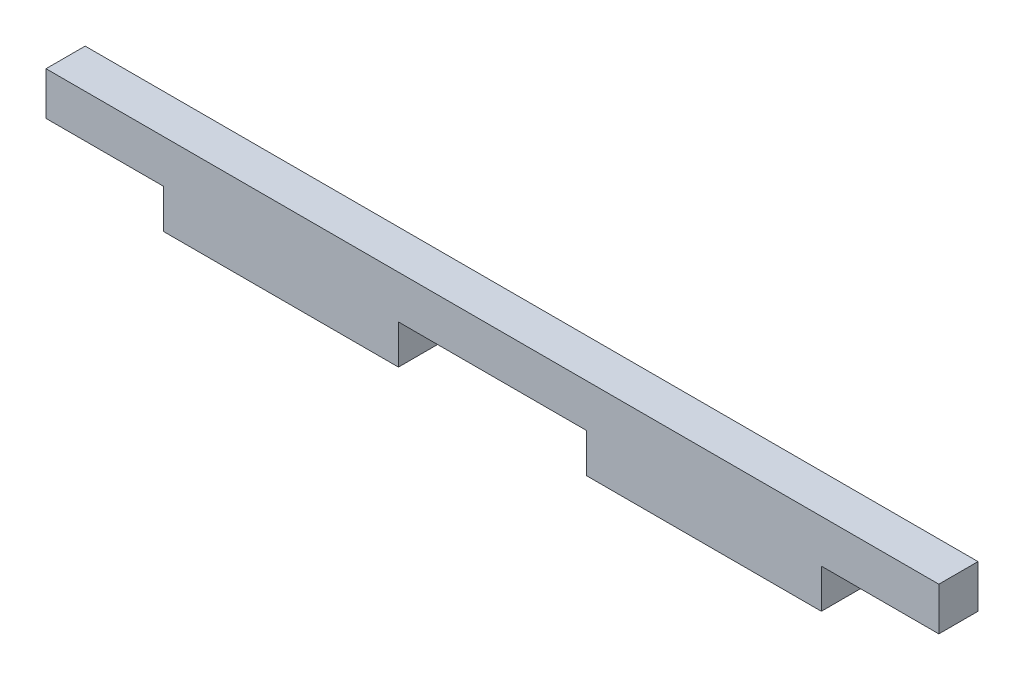
ISO-10303-21;
HEADER;
FILE_DESCRIPTION(('STEP AP214'),'2;1');
FILE_NAME('part.step','',(''),(''),'','','');
FILE_SCHEMA(('AUTOMOTIVE_DESIGN { 1 0 10303 214 1 1 1 1 }'));
ENDSEC;
DATA;
#1=APPLICATION_CONTEXT('core data for automotive mechanical design processes');
#2=APPLICATION_PROTOCOL_DEFINITION('international standard','automotive_design',2000,#1);
#3=PRODUCT_CONTEXT('',#1,'mechanical');
#4=PRODUCT('Part','Part','',(#3));
#5=PRODUCT_RELATED_PRODUCT_CATEGORY('part','',(#4));
#6=PRODUCT_DEFINITION_FORMATION('','',#4);
#7=PRODUCT_DEFINITION_CONTEXT('part definition',#1,'design');
#8=PRODUCT_DEFINITION('design','',#6,#7);
#9=PRODUCT_DEFINITION_SHAPE('','',#8);
#10=(LENGTH_UNIT() NAMED_UNIT(*) SI_UNIT(.MILLI.,.METRE.));
#11=(NAMED_UNIT(*) PLANE_ANGLE_UNIT() SI_UNIT($,.RADIAN.));
#12=(NAMED_UNIT(*) SI_UNIT($,.STERADIAN.) SOLID_ANGLE_UNIT());
#13=UNCERTAINTY_MEASURE_WITH_UNIT(LENGTH_MEASURE(1.E-05),#10,'distance_accuracy_value','');
#14=(GEOMETRIC_REPRESENTATION_CONTEXT(3) GLOBAL_UNCERTAINTY_ASSIGNED_CONTEXT((#13)) GLOBAL_UNIT_ASSIGNED_CONTEXT((#10,
#11,#12)) REPRESENTATION_CONTEXT('',''));
#15=CARTESIAN_POINT('',(0.,0.,0.));
#16=DIRECTION('',(0.,0.,1.));
#17=DIRECTION('',(1.,0.,0.));
#18=AXIS2_PLACEMENT_3D('',#15,#16,#17);
#19=CARTESIAN_POINT('',(-114.,0.,5.));
#20=DIRECTION('',(-1.,0.,0.));
#21=DIRECTION('',(0.,0.,1.));
#22=AXIS2_PLACEMENT_3D('',#19,#20,#21);
#23=PLANE('',#22);
#24=DIRECTION('',(0.,1.,0.));
#25=VECTOR('',#24,1.);
#26=CARTESIAN_POINT('',(-114.,0.,0.));
#27=LINE('',#26,#25);
#28=CARTESIAN_POINT('',(-114.,0.,0.));
#29=VERTEX_POINT('',#28);
#30=CARTESIAN_POINT('',(-114.,5.49999999999998,0.));
#31=VERTEX_POINT('',#30);
#32=EDGE_CURVE('E232',#29,#31,#27,.T.);
#33=ORIENTED_EDGE('',*,*,#32,.F.);
#34=DIRECTION('',(0.,0.,-1.));
#35=VECTOR('',#34,1.);
#36=CARTESIAN_POINT('',(-114.,0.,5.));
#37=LINE('',#36,#35);
#38=CARTESIAN_POINT('',(-114.,0.,5.));
#39=VERTEX_POINT('',#38);
#40=EDGE_CURVE('E11',#39,#29,#37,.T.);
#41=ORIENTED_EDGE('',*,*,#40,.F.);
#42=DIRECTION('',(0.,1.,0.));
#43=VECTOR('',#42,1.);
#44=CARTESIAN_POINT('',(-114.,0.,5.));
#45=LINE('',#44,#43);
#46=CARTESIAN_POINT('',(-114.,5.49999999999998,5.));
#47=VERTEX_POINT('',#46);
#48=EDGE_CURVE('E171',#39,#47,#45,.T.);
#49=ORIENTED_EDGE('',*,*,#48,.T.);
#50=DIRECTION('',(0.,0.,-1.));
#51=VECTOR('',#50,1.);
#52=CARTESIAN_POINT('',(-114.,5.49999999999998,5.));
#53=LINE('',#52,#51);
#54=EDGE_CURVE('E104',#47,#31,#53,.T.);
#55=ORIENTED_EDGE('',*,*,#54,.T.);
#56=EDGE_LOOP('',(#33,#41,#49,#55));
#57=FACE_BOUND('',#56,.T.);
#58=ADVANCED_FACE('F41',(#57),#23,.T.);
#59=CARTESIAN_POINT('',(0.,0.,5.));
#60=DIRECTION('',(0.,-1.,0.));
#61=DIRECTION('',(1.,0.,0.));
#62=AXIS2_PLACEMENT_3D('',#59,#60,#61);
#63=PLANE('',#62);
#64=DIRECTION('',(-1.,0.,0.));
#65=VECTOR('',#64,1.);
#66=CARTESIAN_POINT('',(0.,0.,0.));
#67=LINE('',#66,#65);
#68=CARTESIAN_POINT('',(-99.,0.,0.));
#69=VERTEX_POINT('',#68);
#70=EDGE_CURVE('E224',#69,#29,#67,.T.);
#71=ORIENTED_EDGE('',*,*,#70,.F.);
#72=DIRECTION('',(0.,0.,-1.));
#73=VECTOR('',#72,1.);
#74=CARTESIAN_POINT('',(-99.,0.,5.));
#75=LINE('',#74,#73);
#76=CARTESIAN_POINT('',(-99.,0.,5.));
#77=VERTEX_POINT('',#76);
#78=EDGE_CURVE('E50',#77,#69,#75,.T.);
#79=ORIENTED_EDGE('',*,*,#78,.F.);
#80=DIRECTION('',(-1.,0.,0.));
#81=VECTOR('',#80,1.);
#82=CARTESIAN_POINT('',(0.,0.,5.));
#83=LINE('',#82,#81);
#84=EDGE_CURVE('E158',#77,#39,#83,.T.);
#85=ORIENTED_EDGE('',*,*,#84,.T.);
#86=ORIENTED_EDGE('',*,*,#40,.T.);
#87=EDGE_LOOP('',(#71,#79,#85,#86));
#88=FACE_BOUND('',#87,.T.);
#89=ADVANCED_FACE('F230',(#88),#63,.T.);
#90=CARTESIAN_POINT('',(-99.,-2.74780198594726E-13,5.));
#91=DIRECTION('',(1.,0.,0.));
#92=DIRECTION('',(0.,1.,0.));
#93=AXIS2_PLACEMENT_3D('',#90,#91,#92);
#94=PLANE('',#93);
#95=DIRECTION('',(0.,-1.,0.));
#96=VECTOR('',#95,1.);
#97=CARTESIAN_POINT('',(-99.,-2.74780198594726E-13,0.));
#98=LINE('',#97,#96);
#99=CARTESIAN_POINT('',(-99.,-5.00000000000001,0.));
#100=VERTEX_POINT('',#99);
#101=EDGE_CURVE('E218',#69,#100,#98,.T.);
#102=ORIENTED_EDGE('',*,*,#101,.T.);
#103=DIRECTION('',(0.,0.,-1.));
#104=VECTOR('',#103,1.);
#105=CARTESIAN_POINT('',(-99.,-5.00000000000001,5.));
#106=LINE('',#105,#104);
#107=CARTESIAN_POINT('',(-99.,-5.00000000000001,5.));
#108=VERTEX_POINT('',#107);
#109=EDGE_CURVE('E209',#108,#100,#106,.T.);
#110=ORIENTED_EDGE('',*,*,#109,.F.);
#111=DIRECTION('',(0.,-1.,0.));
#112=VECTOR('',#111,1.);
#113=CARTESIAN_POINT('',(-99.,-2.74780198594726E-13,5.));
#114=LINE('',#113,#112);
#115=EDGE_CURVE('E170',#77,#108,#114,.T.);
#116=ORIENTED_EDGE('',*,*,#115,.F.);
#117=ORIENTED_EDGE('',*,*,#78,.T.);
#118=EDGE_LOOP('',(#102,#110,#116,#117));
#119=FACE_BOUND('',#118,.T.);
#120=ADVANCED_FACE('F216',(#119),#94,.F.);
#121=CARTESIAN_POINT('',(0.,-5.00000000000001,5.));
#122=DIRECTION('',(0.,1.,0.));
#123=DIRECTION('',(-1.,0.,0.));
#124=AXIS2_PLACEMENT_3D('',#121,#122,#123);
#125=PLANE('',#124);
#126=DIRECTION('',(1.,0.,0.));
#127=VECTOR('',#126,1.);
#128=CARTESIAN_POINT('',(0.,-5.00000000000001,0.));
#129=LINE('',#128,#127);
#130=CARTESIAN_POINT('',(-69.,-5.00000000000001,0.));
#131=VERTEX_POINT('',#130);
#132=EDGE_CURVE('E227',#100,#131,#129,.T.);
#133=ORIENTED_EDGE('',*,*,#132,.T.);
#134=DIRECTION('',(0.,0.,-1.));
#135=VECTOR('',#134,1.);
#136=CARTESIAN_POINT('',(-69.,-5.00000000000001,5.));
#137=LINE('',#136,#135);
#138=CARTESIAN_POINT('',(-69.,-5.00000000000001,5.));
#139=VERTEX_POINT('',#138);
#140=EDGE_CURVE('E206',#139,#131,#137,.T.);
#141=ORIENTED_EDGE('',*,*,#140,.F.);
#142=DIRECTION('',(1.,0.,0.));
#143=VECTOR('',#142,1.);
#144=CARTESIAN_POINT('',(0.,-5.00000000000001,5.));
#145=LINE('',#144,#143);
#146=EDGE_CURVE('E176',#108,#139,#145,.T.);
#147=ORIENTED_EDGE('',*,*,#146,.F.);
#148=ORIENTED_EDGE('',*,*,#109,.T.);
#149=EDGE_LOOP('',(#133,#141,#147,#148));
#150=FACE_BOUND('',#149,.T.);
#151=ADVANCED_FACE('F280',(#150),#125,.F.);
#152=CARTESIAN_POINT('',(-69.,0.,5.));
#153=DIRECTION('',(1.,0.,0.));
#154=DIRECTION('',(0.,0.,-1.));
#155=AXIS2_PLACEMENT_3D('',#152,#153,#154);
#156=PLANE('',#155);
#157=DIRECTION('',(0.,-1.,0.));
#158=VECTOR('',#157,1.);
#159=CARTESIAN_POINT('',(-69.,0.,0.));
#160=LINE('',#159,#158);
#161=CARTESIAN_POINT('',(-69.,0.,0.));
#162=VERTEX_POINT('',#161);
#163=EDGE_CURVE('E242',#162,#131,#160,.T.);
#164=ORIENTED_EDGE('',*,*,#163,.F.);
#165=DIRECTION('',(0.,0.,-1.));
#166=VECTOR('',#165,1.);
#167=CARTESIAN_POINT('',(-69.,0.,5.));
#168=LINE('',#167,#166);
#169=CARTESIAN_POINT('',(-69.,0.,5.));
#170=VERTEX_POINT('',#169);
#171=EDGE_CURVE('E203',#170,#162,#168,.T.);
#172=ORIENTED_EDGE('',*,*,#171,.F.);
#173=DIRECTION('',(0.,-1.,0.));
#174=VECTOR('',#173,1.);
#175=CARTESIAN_POINT('',(-69.,0.,5.));
#176=LINE('',#175,#174);
#177=EDGE_CURVE('E167',#170,#139,#176,.T.);
#178=ORIENTED_EDGE('',*,*,#177,.T.);
#179=ORIENTED_EDGE('',*,*,#140,.T.);
#180=EDGE_LOOP('',(#164,#172,#178,#179));
#181=FACE_BOUND('',#180,.T.);
#182=ADVANCED_FACE('F276',(#181),#156,.T.);
#183=CARTESIAN_POINT('',(-45.,0.,0.));
#184=VERTEX_POINT('',#183);
#185=EDGE_CURVE('E234',#184,#162,#67,.T.);
#186=ORIENTED_EDGE('',*,*,#185,.F.);
#187=DIRECTION('',(0.,0.,-1.));
#188=VECTOR('',#187,1.);
#189=CARTESIAN_POINT('',(-45.,0.,5.));
#190=LINE('',#189,#188);
#191=CARTESIAN_POINT('',(-45.,0.,5.));
#192=VERTEX_POINT('',#191);
#193=EDGE_CURVE('E200',#192,#184,#190,.T.);
#194=ORIENTED_EDGE('',*,*,#193,.F.);
#195=EDGE_CURVE('E157',#192,#170,#83,.T.);
#196=ORIENTED_EDGE('',*,*,#195,.T.);
#197=ORIENTED_EDGE('',*,*,#171,.T.);
#198=EDGE_LOOP('',(#186,#194,#196,#197));
#199=FACE_BOUND('',#198,.T.);
#200=ADVANCED_FACE('F272',(#199),#63,.T.);
#201=CARTESIAN_POINT('',(-45.,0.,5.));
#202=DIRECTION('',(1.,0.,0.));
#203=DIRECTION('',(0.,0.,-1.));
#204=AXIS2_PLACEMENT_3D('',#201,#202,#203);
#205=PLANE('',#204);
#206=DIRECTION('',(0.,-1.,0.));
#207=VECTOR('',#206,1.);
#208=CARTESIAN_POINT('',(-45.,0.,0.));
#209=LINE('',#208,#207);
#210=CARTESIAN_POINT('',(-45.,-5.00000000000001,0.));
#211=VERTEX_POINT('',#210);
#212=EDGE_CURVE('E241',#184,#211,#209,.T.);
#213=ORIENTED_EDGE('',*,*,#212,.T.);
#214=DIRECTION('',(0.,0.,-1.));
#215=VECTOR('',#214,1.);
#216=CARTESIAN_POINT('',(-45.,-5.00000000000001,5.));
#217=LINE('',#216,#215);
#218=CARTESIAN_POINT('',(-45.,-5.00000000000001,5.));
#219=VERTEX_POINT('',#218);
#220=EDGE_CURVE('E196',#219,#211,#217,.T.);
#221=ORIENTED_EDGE('',*,*,#220,.F.);
#222=DIRECTION('',(0.,-1.,0.));
#223=VECTOR('',#222,1.);
#224=CARTESIAN_POINT('',(-45.,0.,5.));
#225=LINE('',#224,#223);
#226=EDGE_CURVE('E166',#192,#219,#225,.T.);
#227=ORIENTED_EDGE('',*,*,#226,.F.);
#228=ORIENTED_EDGE('',*,*,#193,.T.);
#229=EDGE_LOOP('',(#213,#221,#227,#228));
#230=FACE_BOUND('',#229,.T.);
#231=ADVANCED_FACE('F269',(#230),#205,.F.);
#232=CARTESIAN_POINT('',(0.,-5.00000000000001,5.));
#233=DIRECTION('',(0.,1.,0.));
#234=DIRECTION('',(0.,0.,1.));
#235=AXIS2_PLACEMENT_3D('',#232,#233,#234);
#236=PLANE('',#235);
#237=DIRECTION('',(1.,0.,0.));
#238=VECTOR('',#237,1.);
#239=CARTESIAN_POINT('',(0.,-5.00000000000001,0.));
#240=LINE('',#239,#238);
#241=CARTESIAN_POINT('',(-15.,-5.00000000000001,0.));
#242=VERTEX_POINT('',#241);
#243=EDGE_CURVE('E247',#211,#242,#240,.T.);
#244=ORIENTED_EDGE('',*,*,#243,.T.);
#245=DIRECTION('',(0.,0.,-1.));
#246=VECTOR('',#245,1.);
#247=CARTESIAN_POINT('',(-15.,-5.00000000000001,5.));
#248=LINE('',#247,#246);
#249=CARTESIAN_POINT('',(-15.,-5.00000000000001,5.));
#250=VERTEX_POINT('',#249);
#251=EDGE_CURVE('E193',#250,#242,#248,.T.);
#252=ORIENTED_EDGE('',*,*,#251,.F.);
#253=DIRECTION('',(1.,0.,0.));
#254=VECTOR('',#253,1.);
#255=CARTESIAN_POINT('',(0.,-5.00000000000001,5.));
#256=LINE('',#255,#254);
#257=EDGE_CURVE('E160',#219,#250,#256,.T.);
#258=ORIENTED_EDGE('',*,*,#257,.F.);
#259=ORIENTED_EDGE('',*,*,#220,.T.);
#260=EDGE_LOOP('',(#244,#252,#258,#259));
#261=FACE_BOUND('',#260,.T.);
#262=ADVANCED_FACE('F265',(#261),#236,.F.);
#263=CARTESIAN_POINT('',(-15.,0.,5.));
#264=DIRECTION('',(1.,0.,0.));
#265=DIRECTION('',(0.,0.,-1.));
#266=AXIS2_PLACEMENT_3D('',#263,#264,#265);
#267=PLANE('',#266);
#268=DIRECTION('',(0.,-1.,0.));
#269=VECTOR('',#268,1.);
#270=CARTESIAN_POINT('',(-15.,0.,0.));
#271=LINE('',#270,#269);
#272=CARTESIAN_POINT('',(-15.,0.,0.));
#273=VERTEX_POINT('',#272);
#274=EDGE_CURVE('E238',#273,#242,#271,.T.);
#275=ORIENTED_EDGE('',*,*,#274,.F.);
#276=DIRECTION('',(0.,0.,-1.));
#277=VECTOR('',#276,1.);
#278=CARTESIAN_POINT('',(-15.,0.,5.));
#279=LINE('',#278,#277);
#280=CARTESIAN_POINT('',(-15.,0.,5.));
#281=VERTEX_POINT('',#280);
#282=EDGE_CURVE('E144',#281,#273,#279,.T.);
#283=ORIENTED_EDGE('',*,*,#282,.F.);
#284=DIRECTION('',(0.,-1.,0.));
#285=VECTOR('',#284,1.);
#286=CARTESIAN_POINT('',(-15.,0.,5.));
#287=LINE('',#286,#285);
#288=EDGE_CURVE('E154',#281,#250,#287,.T.);
#289=ORIENTED_EDGE('',*,*,#288,.T.);
#290=ORIENTED_EDGE('',*,*,#251,.T.);
#291=EDGE_LOOP('',(#275,#283,#289,#290));
#292=FACE_BOUND('',#291,.T.);
#293=ADVANCED_FACE('F261',(#292),#267,.T.);
#294=CARTESIAN_POINT('',(0.,0.,0.));
#295=VERTEX_POINT('',#294);
#296=EDGE_CURVE('E142',#295,#273,#67,.T.);
#297=ORIENTED_EDGE('',*,*,#296,.F.);
#298=DIRECTION('',(0.,0.,-1.));
#299=VECTOR('',#298,1.);
#300=CARTESIAN_POINT('',(0.,0.,5.));
#301=LINE('',#300,#299);
#302=CARTESIAN_POINT('',(0.,0.,5.));
#303=VERTEX_POINT('',#302);
#304=EDGE_CURVE('E136',#303,#295,#301,.T.);
#305=ORIENTED_EDGE('',*,*,#304,.F.);
#306=EDGE_CURVE('E140',#303,#281,#83,.T.);
#307=ORIENTED_EDGE('',*,*,#306,.T.);
#308=ORIENTED_EDGE('',*,*,#282,.T.);
#309=EDGE_LOOP('',(#297,#305,#307,#308));
#310=FACE_BOUND('',#309,.T.);
#311=ADVANCED_FACE('F138',(#310),#63,.T.);
#312=CARTESIAN_POINT('',(0.,0.,5.));
#313=DIRECTION('',(-1.,0.,0.));
#314=DIRECTION('',(0.,0.,1.));
#315=AXIS2_PLACEMENT_3D('',#312,#313,#314);
#316=PLANE('',#315);
#317=DIRECTION('',(0.,1.,0.));
#318=VECTOR('',#317,1.);
#319=CARTESIAN_POINT('',(0.,0.,0.));
#320=LINE('',#319,#318);
#321=CARTESIAN_POINT('',(0.,5.5,0.));
#322=VERTEX_POINT('',#321);
#323=EDGE_CURVE('E97',#295,#322,#320,.T.);
#324=ORIENTED_EDGE('',*,*,#323,.T.);
#325=DIRECTION('',(0.,0.,-1.));
#326=VECTOR('',#325,1.);
#327=CARTESIAN_POINT('',(0.,5.5,5.));
#328=LINE('',#327,#326);
#329=CARTESIAN_POINT('',(0.,5.5,5.));
#330=VERTEX_POINT('',#329);
#331=EDGE_CURVE('E145',#330,#322,#328,.T.);
#332=ORIENTED_EDGE('',*,*,#331,.F.);
#333=DIRECTION('',(0.,1.,0.));
#334=VECTOR('',#333,1.);
#335=CARTESIAN_POINT('',(0.,0.,5.));
#336=LINE('',#335,#334);
#337=EDGE_CURVE('E147',#303,#330,#336,.T.);
#338=ORIENTED_EDGE('',*,*,#337,.F.);
#339=ORIENTED_EDGE('',*,*,#304,.T.);
#340=EDGE_LOOP('',(#324,#332,#338,#339));
#341=FACE_BOUND('',#340,.T.);
#342=ADVANCED_FACE('F148',(#341),#316,.F.);
#343=CARTESIAN_POINT('',(0.,5.5,5.));
#344=DIRECTION('',(0.,-1.,0.));
#345=DIRECTION('',(1.,0.,0.));
#346=AXIS2_PLACEMENT_3D('',#343,#344,#345);
#347=PLANE('',#346);
#348=DIRECTION('',(-1.,0.,0.));
#349=VECTOR('',#348,1.);
#350=CARTESIAN_POINT('',(0.,5.5,0.));
#351=LINE('',#350,#349);
#352=EDGE_CURVE('E177',#322,#31,#351,.T.);
#353=ORIENTED_EDGE('',*,*,#352,.T.);
#354=ORIENTED_EDGE('',*,*,#54,.F.);
#355=DIRECTION('',(-1.,0.,0.));
#356=VECTOR('',#355,1.);
#357=CARTESIAN_POINT('',(0.,5.5,5.));
#358=LINE('',#357,#356);
#359=EDGE_CURVE('E58',#330,#47,#358,.T.);
#360=ORIENTED_EDGE('',*,*,#359,.F.);
#361=ORIENTED_EDGE('',*,*,#331,.T.);
#362=EDGE_LOOP('',(#353,#354,#360,#361));
#363=FACE_BOUND('',#362,.T.);
#364=ADVANCED_FACE('F313',(#363),#347,.F.);
#365=CARTESIAN_POINT('',(0.,0.,5.));
#366=DIRECTION('',(0.,0.,1.));
#367=DIRECTION('',(1.,0.,0.));
#368=AXIS2_PLACEMENT_3D('',#365,#366,#367);
#369=PLANE('',#368);
#370=ORIENTED_EDGE('',*,*,#48,.F.);
#371=ORIENTED_EDGE('',*,*,#84,.F.);
#372=ORIENTED_EDGE('',*,*,#115,.T.);
#373=ORIENTED_EDGE('',*,*,#146,.T.);
#374=ORIENTED_EDGE('',*,*,#177,.F.);
#375=ORIENTED_EDGE('',*,*,#195,.F.);
#376=ORIENTED_EDGE('',*,*,#226,.T.);
#377=ORIENTED_EDGE('',*,*,#257,.T.);
#378=ORIENTED_EDGE('',*,*,#288,.F.);
#379=ORIENTED_EDGE('',*,*,#306,.F.);
#380=ORIENTED_EDGE('',*,*,#337,.T.);
#381=ORIENTED_EDGE('',*,*,#359,.T.);
#382=EDGE_LOOP('',(#370,#371,#372,#373,#374,#375,#376,#377,#378,#379,#380,#381));
#383=FACE_BOUND('',#382,.T.);
#384=ADVANCED_FACE('F152',(#383),#369,.T.);
#385=CARTESIAN_POINT('',(0.,0.,0.));
#386=DIRECTION('',(0.,0.,1.));
#387=DIRECTION('',(1.,0.,0.));
#388=AXIS2_PLACEMENT_3D('',#385,#386,#387);
#389=PLANE('',#388);
#390=ORIENTED_EDGE('',*,*,#32,.T.);
#391=ORIENTED_EDGE('',*,*,#352,.F.);
#392=ORIENTED_EDGE('',*,*,#323,.F.);
#393=ORIENTED_EDGE('',*,*,#296,.T.);
#394=ORIENTED_EDGE('',*,*,#274,.T.);
#395=ORIENTED_EDGE('',*,*,#243,.F.);
#396=ORIENTED_EDGE('',*,*,#212,.F.);
#397=ORIENTED_EDGE('',*,*,#185,.T.);
#398=ORIENTED_EDGE('',*,*,#163,.T.);
#399=ORIENTED_EDGE('',*,*,#132,.F.);
#400=ORIENTED_EDGE('',*,*,#101,.F.);
#401=ORIENTED_EDGE('',*,*,#70,.T.);
#402=EDGE_LOOP('',(#390,#391,#392,#393,#394,#395,#396,#397,#398,#399,#400,#401));
#403=FACE_BOUND('',#402,.T.);
#404=ADVANCED_FACE('F223',(#403),#389,.F.);
#405=CLOSED_SHELL('',(#58,#89,#120,#151,#182,#200,#231,#262,#293,#311,#342,#364,#384,#404));
#406=MANIFOLD_SOLID_BREP('B2',#405);
#407=ADVANCED_BREP_SHAPE_REPRESENTATION('',(#18,#406),#14);
#408=SHAPE_DEFINITION_REPRESENTATION(#9,#407);
ENDSEC;
END-ISO-10303-21;
